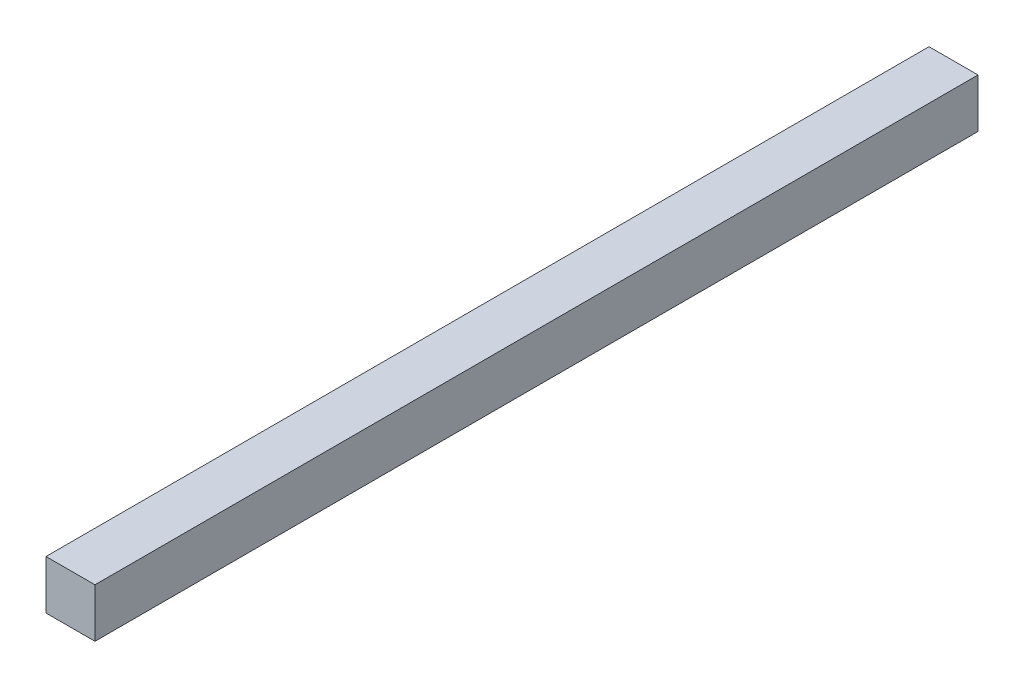
ISO-10303-21;
HEADER;
FILE_DESCRIPTION(('STEP AP214'),'2;1');
FILE_NAME('part.step','',(''),(''),'','','');
FILE_SCHEMA(('AUTOMOTIVE_DESIGN { 1 0 10303 214 1 1 1 1 }'));
ENDSEC;
DATA;
#1=APPLICATION_CONTEXT('core data for automotive mechanical design processes');
#2=APPLICATION_PROTOCOL_DEFINITION('international standard','automotive_design',2000,#1);
#3=PRODUCT_CONTEXT('',#1,'mechanical');
#4=PRODUCT('Part','Part','',(#3));
#5=PRODUCT_RELATED_PRODUCT_CATEGORY('part','',(#4));
#6=PRODUCT_DEFINITION_FORMATION('','',#4);
#7=PRODUCT_DEFINITION_CONTEXT('part definition',#1,'design');
#8=PRODUCT_DEFINITION('design','',#6,#7);
#9=PRODUCT_DEFINITION_SHAPE('','',#8);
#10=(LENGTH_UNIT() NAMED_UNIT(*) SI_UNIT(.MILLI.,.METRE.));
#11=(NAMED_UNIT(*) PLANE_ANGLE_UNIT() SI_UNIT($,.RADIAN.));
#12=(NAMED_UNIT(*) SI_UNIT($,.STERADIAN.) SOLID_ANGLE_UNIT());
#13=UNCERTAINTY_MEASURE_WITH_UNIT(LENGTH_MEASURE(1.E-05),#10,'distance_accuracy_value','');
#14=(GEOMETRIC_REPRESENTATION_CONTEXT(3) GLOBAL_UNCERTAINTY_ASSIGNED_CONTEXT((#13)) GLOBAL_UNIT_ASSIGNED_CONTEXT((#10,
#11,#12)) REPRESENTATION_CONTEXT('',''));
#15=CARTESIAN_POINT('',(0.,0.,0.));
#16=DIRECTION('',(0.,0.,1.));
#17=DIRECTION('',(1.,0.,0.));
#18=AXIS2_PLACEMENT_3D('',#15,#16,#17);
#19=CARTESIAN_POINT('',(2.22,-0.32,8.54));
#20=DIRECTION('',(0.,-1.,0.));
#21=DIRECTION('',(1.,0.,0.));
#22=AXIS2_PLACEMENT_3D('',#19,#20,#21);
#23=PLANE('',#22);
#24=DIRECTION('',(-1.,0.,0.));
#25=VECTOR('',#24,1.);
#26=CARTESIAN_POINT('',(2.22,-0.32,-3.));
#27=LINE('',#26,#25);
#28=CARTESIAN_POINT('',(2.86,-0.32,-3.));
#29=VERTEX_POINT('',#28);
#30=CARTESIAN_POINT('',(2.22,-0.32,-3.));
#31=VERTEX_POINT('',#30);
#32=EDGE_CURVE('E11',#29,#31,#27,.T.);
#33=ORIENTED_EDGE('',*,*,#32,.F.);
#34=DIRECTION('',(0.,0.,-1.));
#35=VECTOR('',#34,1.);
#36=CARTESIAN_POINT('',(2.86,-0.32,8.54));
#37=LINE('',#36,#35);
#38=CARTESIAN_POINT('',(2.86,-0.32,8.54));
#39=VERTEX_POINT('',#38);
#40=EDGE_CURVE('E24',#39,#29,#37,.T.);
#41=ORIENTED_EDGE('',*,*,#40,.F.);
#42=DIRECTION('',(-1.,0.,0.));
#43=VECTOR('',#42,1.);
#44=CARTESIAN_POINT('',(2.22,-0.32,8.54));
#45=LINE('',#44,#43);
#46=CARTESIAN_POINT('',(2.22,-0.32,8.54));
#47=VERTEX_POINT('',#46);
#48=EDGE_CURVE('E84',#39,#47,#45,.T.);
#49=ORIENTED_EDGE('',*,*,#48,.T.);
#50=DIRECTION('',(0.,0.,-1.));
#51=VECTOR('',#50,1.);
#52=CARTESIAN_POINT('',(2.22,-0.32,8.54));
#53=LINE('',#52,#51);
#54=EDGE_CURVE('E82',#47,#31,#53,.T.);
#55=ORIENTED_EDGE('',*,*,#54,.T.);
#56=EDGE_LOOP('',(#33,#41,#49,#55));
#57=FACE_BOUND('',#56,.T.);
#58=ADVANCED_FACE('F17',(#57),#23,.T.);
#59=CARTESIAN_POINT('',(2.22,0.32,8.54));
#60=DIRECTION('',(-1.,0.,0.));
#61=DIRECTION('',(0.,-1.,0.));
#62=AXIS2_PLACEMENT_3D('',#59,#60,#61);
#63=PLANE('',#62);
#64=DIRECTION('',(0.,1.,0.));
#65=VECTOR('',#64,1.);
#66=CARTESIAN_POINT('',(2.22,0.32,-3.));
#67=LINE('',#66,#65);
#68=CARTESIAN_POINT('',(2.22,0.32,-3.));
#69=VERTEX_POINT('',#68);
#70=EDGE_CURVE('E56',#31,#69,#67,.T.);
#71=ORIENTED_EDGE('',*,*,#70,.F.);
#72=ORIENTED_EDGE('',*,*,#54,.F.);
#73=DIRECTION('',(0.,1.,0.));
#74=VECTOR('',#73,1.);
#75=CARTESIAN_POINT('',(2.22,0.32,8.54));
#76=LINE('',#75,#74);
#77=CARTESIAN_POINT('',(2.22,0.32,8.54));
#78=VERTEX_POINT('',#77);
#79=EDGE_CURVE('E79',#47,#78,#76,.T.);
#80=ORIENTED_EDGE('',*,*,#79,.T.);
#81=DIRECTION('',(0.,0.,-1.));
#82=VECTOR('',#81,1.);
#83=CARTESIAN_POINT('',(2.22,0.32,8.54));
#84=LINE('',#83,#82);
#85=EDGE_CURVE('E77',#78,#69,#84,.T.);
#86=ORIENTED_EDGE('',*,*,#85,.T.);
#87=EDGE_LOOP('',(#71,#72,#80,#86));
#88=FACE_BOUND('',#87,.T.);
#89=ADVANCED_FACE('F90',(#88),#63,.T.);
#90=CARTESIAN_POINT('',(2.22,0.32,8.54));
#91=DIRECTION('',(0.,0.,1.));
#92=DIRECTION('',(1.,0.,0.));
#93=AXIS2_PLACEMENT_3D('',#90,#91,#92);
#94=PLANE('',#93);
#95=ORIENTED_EDGE('',*,*,#79,.F.);
#96=ORIENTED_EDGE('',*,*,#48,.F.);
#97=DIRECTION('',(0.,-1.,0.));
#98=VECTOR('',#97,1.);
#99=CARTESIAN_POINT('',(2.86,0.32,8.54));
#100=LINE('',#99,#98);
#101=CARTESIAN_POINT('',(2.86,0.32,8.54));
#102=VERTEX_POINT('',#101);
#103=EDGE_CURVE('E75',#102,#39,#100,.T.);
#104=ORIENTED_EDGE('',*,*,#103,.F.);
#105=DIRECTION('',(1.,0.,0.));
#106=VECTOR('',#105,1.);
#107=CARTESIAN_POINT('',(2.22,0.32,8.54));
#108=LINE('',#107,#106);
#109=EDGE_CURVE('E61',#78,#102,#108,.T.);
#110=ORIENTED_EDGE('',*,*,#109,.F.);
#111=EDGE_LOOP('',(#95,#96,#104,#110));
#112=FACE_BOUND('',#111,.T.);
#113=ADVANCED_FACE('F91',(#112),#94,.T.);
#114=CARTESIAN_POINT('',(2.22,0.32,-3.));
#115=DIRECTION('',(0.,0.,1.));
#116=DIRECTION('',(1.,0.,0.));
#117=AXIS2_PLACEMENT_3D('',#114,#115,#116);
#118=PLANE('',#117);
#119=ORIENTED_EDGE('',*,*,#70,.T.);
#120=DIRECTION('',(1.,0.,0.));
#121=VECTOR('',#120,1.);
#122=CARTESIAN_POINT('',(2.22,0.32,-3.));
#123=LINE('',#122,#121);
#124=CARTESIAN_POINT('',(2.86,0.32,-3.));
#125=VERTEX_POINT('',#124);
#126=EDGE_CURVE('E51',#69,#125,#123,.T.);
#127=ORIENTED_EDGE('',*,*,#126,.T.);
#128=DIRECTION('',(0.,-1.,0.));
#129=VECTOR('',#128,1.);
#130=CARTESIAN_POINT('',(2.86,0.32,-3.));
#131=LINE('',#130,#129);
#132=EDGE_CURVE('E54',#125,#29,#131,.T.);
#133=ORIENTED_EDGE('',*,*,#132,.T.);
#134=ORIENTED_EDGE('',*,*,#32,.T.);
#135=EDGE_LOOP('',(#119,#127,#133,#134));
#136=FACE_BOUND('',#135,.T.);
#137=ADVANCED_FACE('F53',(#136),#118,.F.);
#138=CARTESIAN_POINT('',(2.86,0.32,8.54));
#139=DIRECTION('',(1.,0.,0.));
#140=DIRECTION('',(0.,1.,0.));
#141=AXIS2_PLACEMENT_3D('',#138,#139,#140);
#142=PLANE('',#141);
#143=ORIENTED_EDGE('',*,*,#132,.F.);
#144=DIRECTION('',(0.,0.,-1.));
#145=VECTOR('',#144,1.);
#146=CARTESIAN_POINT('',(2.86,0.32,8.54));
#147=LINE('',#146,#145);
#148=EDGE_CURVE('E67',#102,#125,#147,.T.);
#149=ORIENTED_EDGE('',*,*,#148,.F.);
#150=ORIENTED_EDGE('',*,*,#103,.T.);
#151=ORIENTED_EDGE('',*,*,#40,.T.);
#152=EDGE_LOOP('',(#143,#149,#150,#151));
#153=FACE_BOUND('',#152,.T.);
#154=ADVANCED_FACE('F65',(#153),#142,.T.);
#155=CARTESIAN_POINT('',(2.22,0.32,8.54));
#156=DIRECTION('',(0.,1.,0.));
#157=DIRECTION('',(-1.,0.,0.));
#158=AXIS2_PLACEMENT_3D('',#155,#156,#157);
#159=PLANE('',#158);
#160=ORIENTED_EDGE('',*,*,#126,.F.);
#161=ORIENTED_EDGE('',*,*,#85,.F.);
#162=ORIENTED_EDGE('',*,*,#109,.T.);
#163=ORIENTED_EDGE('',*,*,#148,.T.);
#164=EDGE_LOOP('',(#160,#161,#162,#163));
#165=FACE_BOUND('',#164,.T.);
#166=ADVANCED_FACE('F70',(#165),#159,.T.);
#167=CLOSED_SHELL('',(#58,#89,#113,#137,#154,#166));
#168=MANIFOLD_SOLID_BREP('B1',#167);
#169=ADVANCED_BREP_SHAPE_REPRESENTATION('',(#18,#168),#14);
#170=SHAPE_DEFINITION_REPRESENTATION(#9,#169);
ENDSEC;
END-ISO-10303-21;
